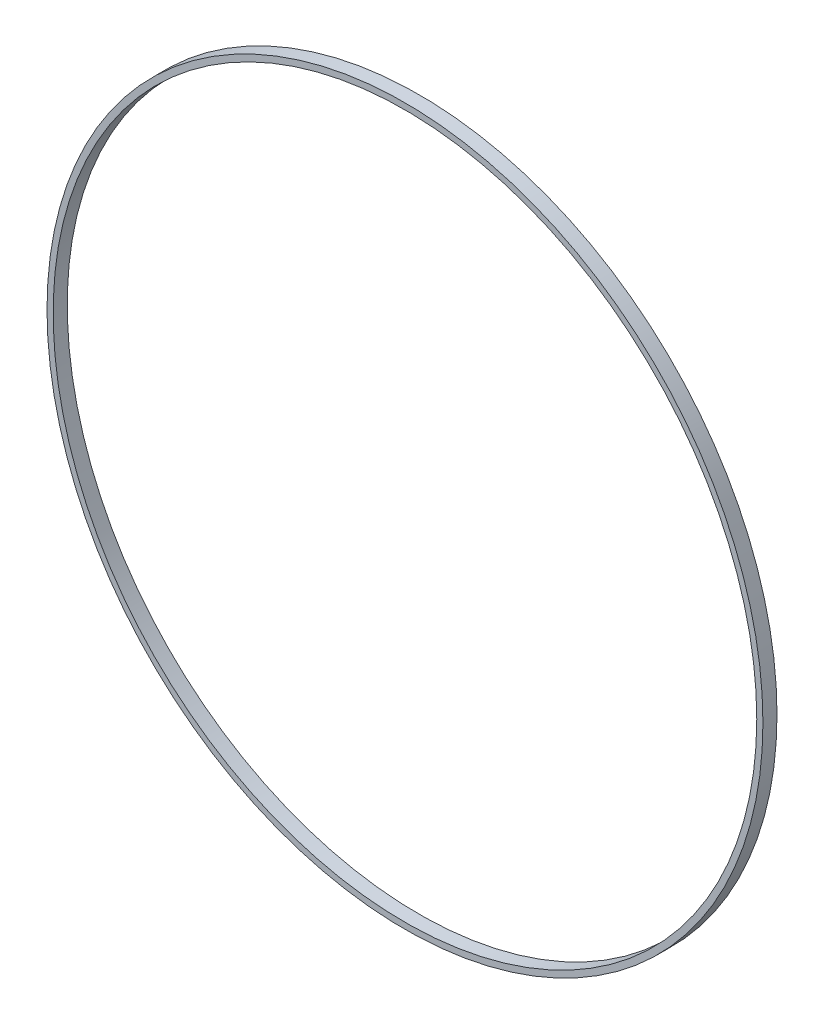
ISO-10303-21;
HEADER;
FILE_DESCRIPTION(('STEP AP214'),'2;1');
FILE_NAME('part.step','',(''),(''),'','','');
FILE_SCHEMA(('AUTOMOTIVE_DESIGN { 1 0 10303 214 1 1 1 1 }'));
ENDSEC;
DATA;
#1=APPLICATION_CONTEXT('core data for automotive mechanical design processes');
#2=APPLICATION_PROTOCOL_DEFINITION('international standard','automotive_design',2000,#1);
#3=PRODUCT_CONTEXT('',#1,'mechanical');
#4=PRODUCT('Part','Part','',(#3));
#5=PRODUCT_RELATED_PRODUCT_CATEGORY('part','',(#4));
#6=PRODUCT_DEFINITION_FORMATION('','',#4);
#7=PRODUCT_DEFINITION_CONTEXT('part definition',#1,'design');
#8=PRODUCT_DEFINITION('design','',#6,#7);
#9=PRODUCT_DEFINITION_SHAPE('','',#8);
#10=(LENGTH_UNIT() NAMED_UNIT(*) SI_UNIT(.MILLI.,.METRE.));
#11=(NAMED_UNIT(*) PLANE_ANGLE_UNIT() SI_UNIT($,.RADIAN.));
#12=(NAMED_UNIT(*) SI_UNIT($,.STERADIAN.) SOLID_ANGLE_UNIT());
#13=UNCERTAINTY_MEASURE_WITH_UNIT(LENGTH_MEASURE(1.E-05),#10,'distance_accuracy_value','');
#14=(GEOMETRIC_REPRESENTATION_CONTEXT(3) GLOBAL_UNCERTAINTY_ASSIGNED_CONTEXT((#13)) GLOBAL_UNIT_ASSIGNED_CONTEXT((#10,
#11,#12)) REPRESENTATION_CONTEXT('',''));
#15=CARTESIAN_POINT('',(0.,0.,0.));
#16=DIRECTION('',(0.,0.,1.));
#17=DIRECTION('',(1.,0.,0.));
#18=AXIS2_PLACEMENT_3D('',#15,#16,#17);
#19=CARTESIAN_POINT('',(0.,0.,0.8));
#20=DIRECTION('',(0.,0.,1.));
#21=DIRECTION('',(1.,0.,0.));
#22=AXIS2_PLACEMENT_3D('',#19,#20,#21);
#23=PLANE('',#22);
#24=CARTESIAN_POINT('',(0.,0.,0.8));
#25=DIRECTION('',(0.,0.,1.));
#26=DIRECTION('',(1.,0.,0.));
#27=AXIS2_PLACEMENT_3D('',#24,#25,#26);
#28=CIRCLE('',#27,20.35);
#29=CARTESIAN_POINT('',(20.35,0.,0.8));
#30=VERTEX_POINT('',#29);
#31=EDGE_CURVE('E10',#30,#30,#28,.T.);
#32=ORIENTED_EDGE('',*,*,#31,.T.);
#33=EDGE_LOOP('',(#32));
#34=FACE_BOUND('',#33,.T.);
#35=CARTESIAN_POINT('',(0.,0.,0.8));
#36=DIRECTION('',(0.,0.,1.));
#37=DIRECTION('',(1.,0.,0.));
#38=AXIS2_PLACEMENT_3D('',#35,#36,#37);
#39=CIRCLE('',#38,20.);
#40=CARTESIAN_POINT('',(20.,0.,0.8));
#41=VERTEX_POINT('',#40);
#42=EDGE_CURVE('E48',#41,#41,#39,.T.);
#43=ORIENTED_EDGE('',*,*,#42,.F.);
#44=EDGE_LOOP('',(#43));
#45=FACE_BOUND('',#44,.T.);
#46=ADVANCED_FACE('F40',(#34,#45),#23,.T.);
#47=CARTESIAN_POINT('',(0.,0.,0.));
#48=DIRECTION('',(0.,0.,1.));
#49=DIRECTION('',(1.,0.,0.));
#50=AXIS2_PLACEMENT_3D('',#47,#48,#49);
#51=PLANE('',#50);
#52=CARTESIAN_POINT('',(0.,0.,0.));
#53=DIRECTION('',(0.,0.,1.));
#54=DIRECTION('',(1.,0.,0.));
#55=AXIS2_PLACEMENT_3D('',#52,#53,#54);
#56=CIRCLE('',#55,20.35);
#57=CARTESIAN_POINT('',(20.35,0.,0.));
#58=VERTEX_POINT('',#57);
#59=EDGE_CURVE('E41',#58,#58,#56,.T.);
#60=ORIENTED_EDGE('',*,*,#59,.F.);
#61=EDGE_LOOP('',(#60));
#62=FACE_BOUND('',#61,.T.);
#63=CARTESIAN_POINT('',(0.,0.,0.));
#64=DIRECTION('',(0.,0.,1.));
#65=DIRECTION('',(1.,0.,0.));
#66=AXIS2_PLACEMENT_3D('',#63,#64,#65);
#67=CIRCLE('',#66,20.);
#68=CARTESIAN_POINT('',(20.,0.,0.));
#69=VERTEX_POINT('',#68);
#70=EDGE_CURVE('E49',#69,#69,#67,.T.);
#71=ORIENTED_EDGE('',*,*,#70,.T.);
#72=EDGE_LOOP('',(#71));
#73=FACE_BOUND('',#72,.T.);
#74=ADVANCED_FACE('F58',(#62,#73),#51,.F.);
#75=CARTESIAN_POINT('',(0.,0.,0.8));
#76=DIRECTION('',(0.,0.,-1.));
#77=DIRECTION('',(-1.,0.,0.));
#78=AXIS2_PLACEMENT_3D('',#75,#76,#77);
#79=CYLINDRICAL_SURFACE('',#78,20.35);
#80=ORIENTED_EDGE('',*,*,#31,.F.);
#81=EDGE_LOOP('',(#80));
#82=FACE_BOUND('',#81,.T.);
#83=ORIENTED_EDGE('',*,*,#59,.T.);
#84=EDGE_LOOP('',(#83));
#85=FACE_BOUND('',#84,.T.);
#86=ADVANCED_FACE('F39',(#82,#85),#79,.T.);
#87=CARTESIAN_POINT('',(0.,0.,0.8));
#88=DIRECTION('',(0.,0.,-1.));
#89=DIRECTION('',(-1.,0.,0.));
#90=AXIS2_PLACEMENT_3D('',#87,#88,#89);
#91=CYLINDRICAL_SURFACE('',#90,20.);
#92=ORIENTED_EDGE('',*,*,#42,.T.);
#93=EDGE_LOOP('',(#92));
#94=FACE_BOUND('',#93,.T.);
#95=ORIENTED_EDGE('',*,*,#70,.F.);
#96=EDGE_LOOP('',(#95));
#97=FACE_BOUND('',#96,.T.);
#98=ADVANCED_FACE('F57',(#94,#97),#91,.F.);
#99=CLOSED_SHELL('',(#46,#74,#86,#98));
#100=MANIFOLD_SOLID_BREP('B2',#99);
#101=ADVANCED_BREP_SHAPE_REPRESENTATION('',(#18,#100),#14);
#102=SHAPE_DEFINITION_REPRESENTATION(#9,#101);
ENDSEC;
END-ISO-10303-21;
